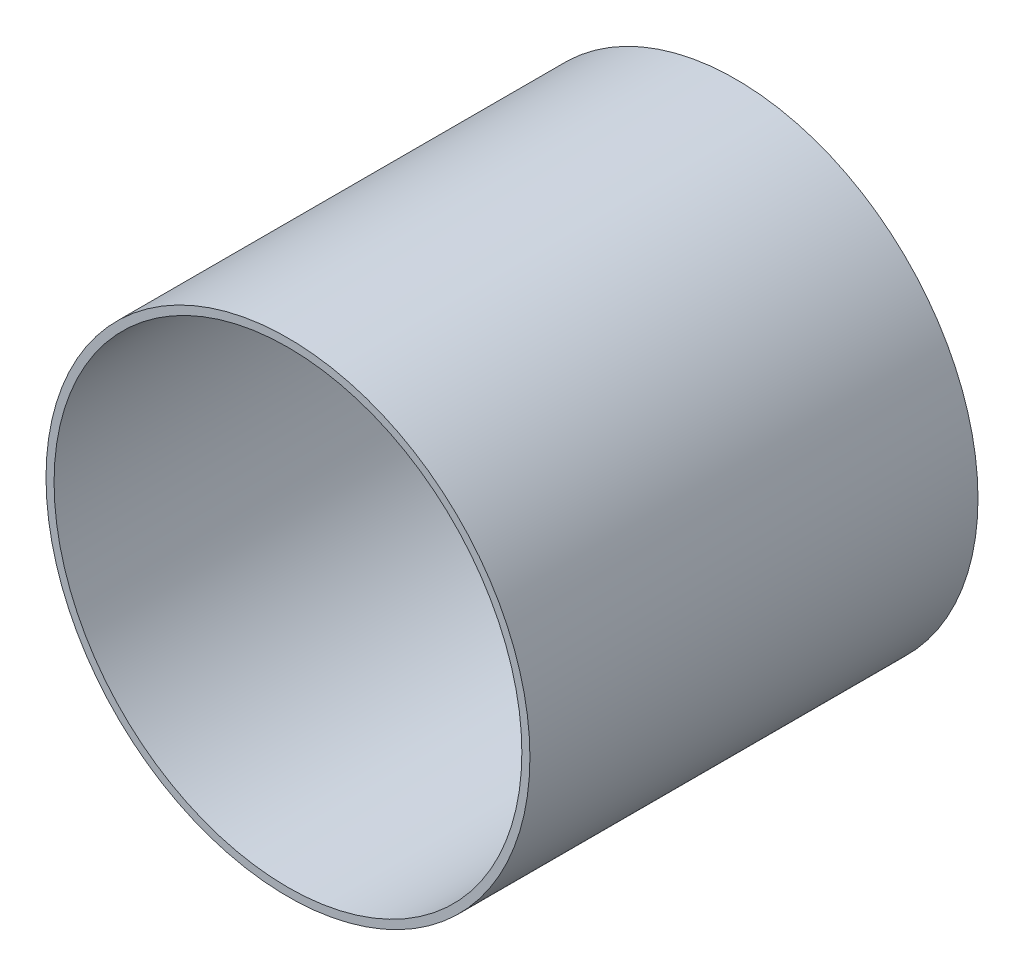
ISO-10303-21;
HEADER;
FILE_DESCRIPTION(('STEP AP214'),'2;1');
FILE_NAME('part.step','',(''),(''),'','','');
FILE_SCHEMA(('AUTOMOTIVE_DESIGN { 1 0 10303 214 1 1 1 1 }'));
ENDSEC;
DATA;
#1=APPLICATION_CONTEXT('core data for automotive mechanical design processes');
#2=APPLICATION_PROTOCOL_DEFINITION('international standard','automotive_design',2000,#1);
#3=PRODUCT_CONTEXT('',#1,'mechanical');
#4=PRODUCT('Part','Part','',(#3));
#5=PRODUCT_RELATED_PRODUCT_CATEGORY('part','',(#4));
#6=PRODUCT_DEFINITION_FORMATION('','',#4);
#7=PRODUCT_DEFINITION_CONTEXT('part definition',#1,'design');
#8=PRODUCT_DEFINITION('design','',#6,#7);
#9=PRODUCT_DEFINITION_SHAPE('','',#8);
#10=(LENGTH_UNIT() NAMED_UNIT(*) SI_UNIT(.MILLI.,.METRE.));
#11=(NAMED_UNIT(*) PLANE_ANGLE_UNIT() SI_UNIT($,.RADIAN.));
#12=(NAMED_UNIT(*) SI_UNIT($,.STERADIAN.) SOLID_ANGLE_UNIT());
#13=UNCERTAINTY_MEASURE_WITH_UNIT(LENGTH_MEASURE(1.E-05),#10,'distance_accuracy_value','');
#14=(GEOMETRIC_REPRESENTATION_CONTEXT(3) GLOBAL_UNCERTAINTY_ASSIGNED_CONTEXT((#13)) GLOBAL_UNIT_ASSIGNED_CONTEXT((#10,
#11,#12)) REPRESENTATION_CONTEXT('',''));
#15=CARTESIAN_POINT('',(0.,0.,0.));
#16=DIRECTION('',(0.,0.,1.));
#17=DIRECTION('',(1.,0.,0.));
#18=AXIS2_PLACEMENT_3D('',#15,#16,#17);
#19=CARTESIAN_POINT('',(0.,0.,25.));
#20=DIRECTION('',(0.,0.,1.));
#21=DIRECTION('',(1.,0.,0.));
#22=AXIS2_PLACEMENT_3D('',#19,#20,#21);
#23=PLANE('',#22);
#24=CARTESIAN_POINT('',(0.,0.,25.));
#25=DIRECTION('',(0.,0.,1.));
#26=DIRECTION('',(1.,0.,0.));
#27=AXIS2_PLACEMENT_3D('',#24,#25,#26);
#28=CIRCLE('',#27,13.5);
#29=CARTESIAN_POINT('',(13.5,0.,25.));
#30=VERTEX_POINT('',#29);
#31=EDGE_CURVE('E10',#30,#30,#28,.T.);
#32=ORIENTED_EDGE('',*,*,#31,.T.);
#33=EDGE_LOOP('',(#32));
#34=FACE_BOUND('',#33,.T.);
#35=CARTESIAN_POINT('',(0.,0.,25.));
#36=DIRECTION('',(0.,0.,1.));
#37=DIRECTION('',(1.,0.,0.));
#38=AXIS2_PLACEMENT_3D('',#35,#36,#37);
#39=CIRCLE('',#38,13.05);
#40=CARTESIAN_POINT('',(13.05,0.,25.));
#41=VERTEX_POINT('',#40);
#42=EDGE_CURVE('E42',#41,#41,#39,.T.);
#43=ORIENTED_EDGE('',*,*,#42,.F.);
#44=EDGE_LOOP('',(#43));
#45=FACE_BOUND('',#44,.T.);
#46=ADVANCED_FACE('F31',(#34,#45),#23,.T.);
#47=CARTESIAN_POINT('',(0.,0.,0.));
#48=DIRECTION('',(0.,0.,1.));
#49=DIRECTION('',(1.,0.,0.));
#50=AXIS2_PLACEMENT_3D('',#47,#48,#49);
#51=PLANE('',#50);
#52=CARTESIAN_POINT('',(0.,0.,0.));
#53=DIRECTION('',(0.,0.,1.));
#54=DIRECTION('',(1.,0.,0.));
#55=AXIS2_PLACEMENT_3D('',#52,#53,#54);
#56=CIRCLE('',#55,13.5);
#57=CARTESIAN_POINT('',(13.5,0.,0.));
#58=VERTEX_POINT('',#57);
#59=EDGE_CURVE('E35',#58,#58,#56,.T.);
#60=ORIENTED_EDGE('',*,*,#59,.F.);
#61=EDGE_LOOP('',(#60));
#62=FACE_BOUND('',#61,.T.);
#63=CARTESIAN_POINT('',(0.,0.,0.));
#64=DIRECTION('',(0.,0.,1.));
#65=DIRECTION('',(1.,0.,0.));
#66=AXIS2_PLACEMENT_3D('',#63,#64,#65);
#67=CIRCLE('',#66,13.05);
#68=CARTESIAN_POINT('',(13.05,0.,0.));
#69=VERTEX_POINT('',#68);
#70=EDGE_CURVE('E44',#69,#69,#67,.T.);
#71=ORIENTED_EDGE('',*,*,#70,.T.);
#72=EDGE_LOOP('',(#71));
#73=FACE_BOUND('',#72,.T.);
#74=ADVANCED_FACE('F54',(#62,#73),#51,.F.);
#75=CARTESIAN_POINT('',(0.,0.,25.));
#76=DIRECTION('',(0.,0.,-1.));
#77=DIRECTION('',(-1.,0.,0.));
#78=AXIS2_PLACEMENT_3D('',#75,#76,#77);
#79=CYLINDRICAL_SURFACE('',#78,13.5);
#80=ORIENTED_EDGE('',*,*,#31,.F.);
#81=EDGE_LOOP('',(#80));
#82=FACE_BOUND('',#81,.T.);
#83=ORIENTED_EDGE('',*,*,#59,.T.);
#84=EDGE_LOOP('',(#83));
#85=FACE_BOUND('',#84,.T.);
#86=ADVANCED_FACE('F33',(#82,#85),#79,.T.);
#87=CARTESIAN_POINT('',(0.,0.,25.));
#88=DIRECTION('',(0.,0.,-1.));
#89=DIRECTION('',(-1.,0.,0.));
#90=AXIS2_PLACEMENT_3D('',#87,#88,#89);
#91=CYLINDRICAL_SURFACE('',#90,13.05);
#92=ORIENTED_EDGE('',*,*,#42,.T.);
#93=EDGE_LOOP('',(#92));
#94=FACE_BOUND('',#93,.T.);
#95=ORIENTED_EDGE('',*,*,#70,.F.);
#96=EDGE_LOOP('',(#95));
#97=FACE_BOUND('',#96,.T.);
#98=ADVANCED_FACE('F50',(#94,#97),#91,.F.);
#99=CLOSED_SHELL('',(#46,#74,#86,#98));
#100=MANIFOLD_SOLID_BREP('B2',#99);
#101=ADVANCED_BREP_SHAPE_REPRESENTATION('',(#18,#100),#14);
#102=SHAPE_DEFINITION_REPRESENTATION(#9,#101);
ENDSEC;
END-ISO-10303-21;
